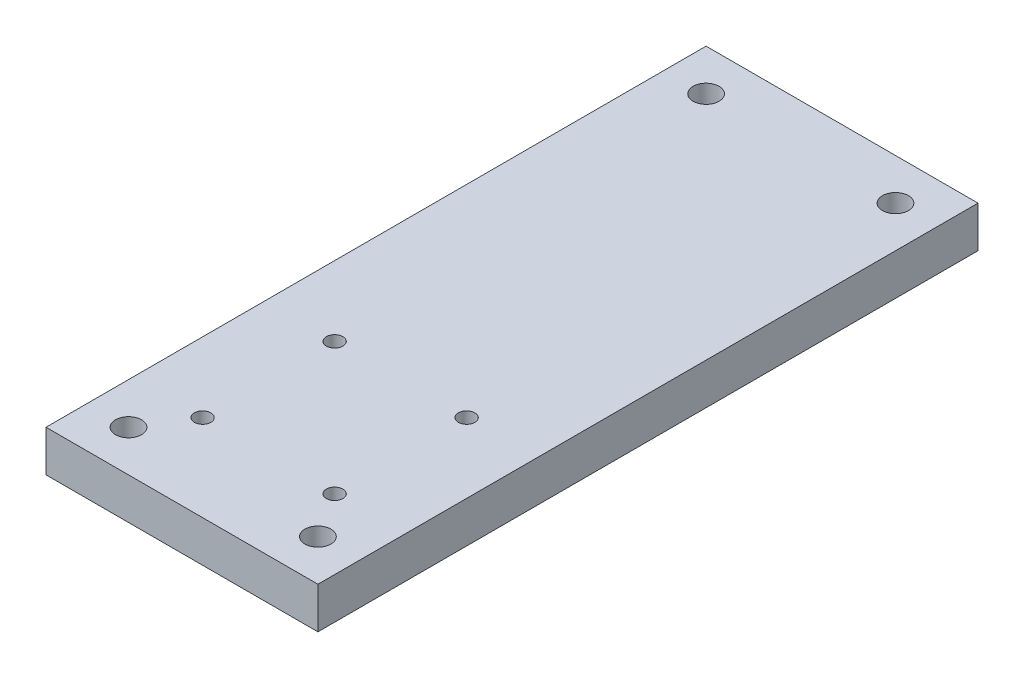
ISO-10303-21;
HEADER;
FILE_DESCRIPTION(('STEP AP214'),'2;1');
FILE_NAME('part.step','',(''),(''),'','','');
FILE_SCHEMA(('AUTOMOTIVE_DESIGN { 1 0 10303 214 1 1 1 1 }'));
ENDSEC;
DATA;
#1=APPLICATION_CONTEXT('core data for automotive mechanical design processes');
#2=APPLICATION_PROTOCOL_DEFINITION('international standard','automotive_design',2000,#1);
#3=PRODUCT_CONTEXT('',#1,'mechanical');
#4=PRODUCT('Part','Part','',(#3));
#5=PRODUCT_RELATED_PRODUCT_CATEGORY('part','',(#4));
#6=PRODUCT_DEFINITION_FORMATION('','',#4);
#7=PRODUCT_DEFINITION_CONTEXT('part definition',#1,'design');
#8=PRODUCT_DEFINITION('design','',#6,#7);
#9=PRODUCT_DEFINITION_SHAPE('','',#8);
#10=(LENGTH_UNIT() NAMED_UNIT(*) SI_UNIT(.MILLI.,.METRE.));
#11=(NAMED_UNIT(*) PLANE_ANGLE_UNIT() SI_UNIT($,.RADIAN.));
#12=(NAMED_UNIT(*) SI_UNIT($,.STERADIAN.) SOLID_ANGLE_UNIT());
#13=UNCERTAINTY_MEASURE_WITH_UNIT(LENGTH_MEASURE(1.E-05),#10,'distance_accuracy_value','');
#14=(GEOMETRIC_REPRESENTATION_CONTEXT(3) GLOBAL_UNCERTAINTY_ASSIGNED_CONTEXT((#13)) GLOBAL_UNIT_ASSIGNED_CONTEXT((#10,
#11,#12)) REPRESENTATION_CONTEXT('',''));
#15=CARTESIAN_POINT('',(0.,0.,0.));
#16=DIRECTION('',(0.,0.,1.));
#17=DIRECTION('',(1.,0.,0.));
#18=AXIS2_PLACEMENT_3D('',#15,#16,#17);
#19=CARTESIAN_POINT('',(20.,5.,0.));
#20=DIRECTION('',(-1.,0.,0.));
#21=DIRECTION('',(0.,0.,1.));
#22=AXIS2_PLACEMENT_3D('',#19,#20,#21);
#23=PLANE('',#22);
#24=DIRECTION('',(0.,0.,-1.));
#25=VECTOR('',#24,1.);
#26=CARTESIAN_POINT('',(20.,5.,0.));
#27=LINE('',#26,#25);
#28=CARTESIAN_POINT('',(20.,5.,-2.9986));
#29=VERTEX_POINT('',#28);
#30=CARTESIAN_POINT('',(20.,5.,-82.99632));
#31=VERTEX_POINT('',#30);
#32=EDGE_CURVE('E11',#29,#31,#27,.T.);
#33=ORIENTED_EDGE('',*,*,#32,.F.);
#34=DIRECTION('',(0.,-1.,0.));
#35=VECTOR('',#34,1.);
#36=CARTESIAN_POINT('',(20.,5.,-2.9986));
#37=LINE('',#36,#35);
#38=CARTESIAN_POINT('',(20.,0.,-2.9986));
#39=VERTEX_POINT('',#38);
#40=EDGE_CURVE('E103',#29,#39,#37,.T.);
#41=ORIENTED_EDGE('',*,*,#40,.T.);
#42=DIRECTION('',(0.,0.,-1.));
#43=VECTOR('',#42,1.);
#44=CARTESIAN_POINT('',(20.,0.,0.));
#45=LINE('',#44,#43);
#46=CARTESIAN_POINT('',(20.,0.,-82.99632));
#47=VERTEX_POINT('',#46);
#48=EDGE_CURVE('E50',#39,#47,#45,.T.);
#49=ORIENTED_EDGE('',*,*,#48,.T.);
#50=DIRECTION('',(0.,-1.,0.));
#51=VECTOR('',#50,1.);
#52=CARTESIAN_POINT('',(20.,5.,-82.99632));
#53=LINE('',#52,#51);
#54=EDGE_CURVE('E158',#31,#47,#53,.T.);
#55=ORIENTED_EDGE('',*,*,#54,.F.);
#56=EDGE_LOOP('',(#33,#41,#49,#55));
#57=FACE_BOUND('',#56,.T.);
#58=ADVANCED_FACE('F47',(#57),#23,.F.);
#59=CARTESIAN_POINT('',(0.,5.,0.));
#60=DIRECTION('',(0.,-1.,0.));
#61=DIRECTION('',(0.,0.,-1.));
#62=AXIS2_PLACEMENT_3D('',#59,#60,#61);
#63=PLANE('',#62);
#64=CARTESIAN_POINT('',(-7.954,5.,-77.99632));
#65=DIRECTION('',(0.,-1.,0.));
#66=DIRECTION('',(0.,0.,-1.));
#67=AXIS2_PLACEMENT_3D('',#64,#65,#66);
#68=CIRCLE('',#67,1.575);
#69=CARTESIAN_POINT('',(-7.954,5.,-79.57132));
#70=VERTEX_POINT('',#69);
#71=EDGE_CURVE('E178',#70,#70,#68,.T.);
#72=ORIENTED_EDGE('',*,*,#71,.T.);
#73=EDGE_LOOP('',(#72));
#74=FACE_BOUND('',#73,.T.);
#75=CARTESIAN_POINT('',(15.,5.,-77.99632));
#76=DIRECTION('',(0.,-1.,0.));
#77=DIRECTION('',(0.,0.,-1.));
#78=AXIS2_PLACEMENT_3D('',#75,#76,#77);
#79=CIRCLE('',#78,1.575);
#80=CARTESIAN_POINT('',(15.,5.,-79.57132));
#81=VERTEX_POINT('',#80);
#82=EDGE_CURVE('E186',#81,#81,#79,.T.);
#83=ORIENTED_EDGE('',*,*,#82,.T.);
#84=EDGE_LOOP('',(#83));
#85=FACE_BOUND('',#84,.T.);
#86=CARTESIAN_POINT('',(15.,5.,-7.9986));
#87=DIRECTION('',(0.,-1.,0.));
#88=DIRECTION('',(0.,0.,-1.));
#89=AXIS2_PLACEMENT_3D('',#86,#87,#88);
#90=CIRCLE('',#89,1.575);
#91=CARTESIAN_POINT('',(15.,5.,-9.5736));
#92=VERTEX_POINT('',#91);
#93=EDGE_CURVE('E194',#92,#92,#90,.T.);
#94=ORIENTED_EDGE('',*,*,#93,.T.);
#95=EDGE_LOOP('',(#94));
#96=FACE_BOUND('',#95,.T.);
#97=CARTESIAN_POINT('',(-7.954,5.,-7.99859999999999));
#98=DIRECTION('',(0.,-1.,0.));
#99=DIRECTION('',(0.,0.,-1.));
#100=AXIS2_PLACEMENT_3D('',#97,#98,#99);
#101=CIRCLE('',#100,1.575);
#102=CARTESIAN_POINT('',(-7.954,5.,-9.5736));
#103=VERTEX_POINT('',#102);
#104=EDGE_CURVE('E163',#103,#103,#101,.T.);
#105=ORIENTED_EDGE('',*,*,#104,.T.);
#106=EDGE_LOOP('',(#105));
#107=FACE_BOUND('',#106,.T.);
#108=CARTESIAN_POINT('',(-4.477,5.,-29.5));
#109=DIRECTION('',(0.,-1.,0.));
#110=DIRECTION('',(0.,0.,-1.));
#111=AXIS2_PLACEMENT_3D('',#108,#109,#110);
#112=CIRCLE('',#111,1.);
#113=CARTESIAN_POINT('',(-4.477,5.,-30.5));
#114=VERTEX_POINT('',#113);
#115=EDGE_CURVE('E131',#114,#114,#112,.T.);
#116=ORIENTED_EDGE('',*,*,#115,.T.);
#117=EDGE_LOOP('',(#116));
#118=FACE_BOUND('',#117,.T.);
#119=CARTESIAN_POINT('',(11.523,5.,-29.5));
#120=DIRECTION('',(0.,-1.,0.));
#121=DIRECTION('',(0.,0.,-1.));
#122=AXIS2_PLACEMENT_3D('',#119,#120,#121);
#123=CIRCLE('',#122,1.);
#124=CARTESIAN_POINT('',(11.523,5.,-30.5));
#125=VERTEX_POINT('',#124);
#126=EDGE_CURVE('E139',#125,#125,#123,.T.);
#127=ORIENTED_EDGE('',*,*,#126,.T.);
#128=EDGE_LOOP('',(#127));
#129=FACE_BOUND('',#128,.T.);
#130=CARTESIAN_POINT('',(11.523,5.,-13.5));
#131=DIRECTION('',(0.,-1.,0.));
#132=DIRECTION('',(0.,0.,-1.));
#133=AXIS2_PLACEMENT_3D('',#130,#131,#132);
#134=CIRCLE('',#133,1.);
#135=CARTESIAN_POINT('',(11.523,5.,-14.5));
#136=VERTEX_POINT('',#135);
#137=EDGE_CURVE('E147',#136,#136,#134,.T.);
#138=ORIENTED_EDGE('',*,*,#137,.T.);
#139=EDGE_LOOP('',(#138));
#140=FACE_BOUND('',#139,.T.);
#141=CARTESIAN_POINT('',(-4.477,5.,-13.5));
#142=DIRECTION('',(0.,-1.,0.));
#143=DIRECTION('',(0.,0.,-1.));
#144=AXIS2_PLACEMENT_3D('',#141,#142,#143);
#145=CIRCLE('',#144,1.);
#146=CARTESIAN_POINT('',(-4.477,5.,-14.5));
#147=VERTEX_POINT('',#146);
#148=EDGE_CURVE('E118',#147,#147,#145,.T.);
#149=ORIENTED_EDGE('',*,*,#148,.T.);
#150=EDGE_LOOP('',(#149));
#151=FACE_BOUND('',#150,.T.);
#152=DIRECTION('',(0.,0.,-1.));
#153=VECTOR('',#152,1.);
#154=CARTESIAN_POINT('',(-12.954,5.,-1.5));
#155=LINE('',#154,#153);
#156=CARTESIAN_POINT('',(-12.954,5.,-2.9986));
#157=VERTEX_POINT('',#156);
#158=CARTESIAN_POINT('',(-12.954,5.,-82.99632));
#159=VERTEX_POINT('',#158);
#160=EDGE_CURVE('E117',#157,#159,#155,.T.);
#161=ORIENTED_EDGE('',*,*,#160,.F.);
#162=DIRECTION('',(1.,0.,0.));
#163=VECTOR('',#162,1.);
#164=CARTESIAN_POINT('',(-12.954,5.,-2.9986));
#165=LINE('',#164,#163);
#166=EDGE_CURVE('E64',#157,#29,#165,.T.);
#167=ORIENTED_EDGE('',*,*,#166,.T.);
#168=ORIENTED_EDGE('',*,*,#32,.T.);
#169=DIRECTION('',(-1.,0.,0.));
#170=VECTOR('',#169,1.);
#171=CARTESIAN_POINT('',(-12.954,5.,-82.99632));
#172=LINE('',#171,#170);
#173=EDGE_CURVE('E154',#31,#159,#172,.T.);
#174=ORIENTED_EDGE('',*,*,#173,.T.);
#175=EDGE_LOOP('',(#161,#167,#168,#174));
#176=FACE_BOUND('',#175,.T.);
#177=ADVANCED_FACE('F206',(#74,#85,#96,#107,#118,#129,#140,#151,#176),#63,.F.);
#178=CARTESIAN_POINT('',(0.,0.,0.));
#179=DIRECTION('',(0.,-1.,0.));
#180=DIRECTION('',(0.,0.,-1.));
#181=AXIS2_PLACEMENT_3D('',#178,#179,#180);
#182=PLANE('',#181);
#183=CARTESIAN_POINT('',(-7.954,0.,-77.99632));
#184=DIRECTION('',(0.,-1.,0.));
#185=DIRECTION('',(0.,0.,-1.));
#186=AXIS2_PLACEMENT_3D('',#183,#184,#185);
#187=CIRCLE('',#186,1.575);
#188=CARTESIAN_POINT('',(-7.954,0.,-79.57132));
#189=VERTEX_POINT('',#188);
#190=EDGE_CURVE('E182',#189,#189,#187,.T.);
#191=ORIENTED_EDGE('',*,*,#190,.F.);
#192=EDGE_LOOP('',(#191));
#193=FACE_BOUND('',#192,.T.);
#194=CARTESIAN_POINT('',(15.,0.,-77.99632));
#195=DIRECTION('',(0.,-1.,0.));
#196=DIRECTION('',(0.,0.,-1.));
#197=AXIS2_PLACEMENT_3D('',#194,#195,#196);
#198=CIRCLE('',#197,1.575);
#199=CARTESIAN_POINT('',(15.,0.,-79.57132));
#200=VERTEX_POINT('',#199);
#201=EDGE_CURVE('E190',#200,#200,#198,.T.);
#202=ORIENTED_EDGE('',*,*,#201,.F.);
#203=EDGE_LOOP('',(#202));
#204=FACE_BOUND('',#203,.T.);
#205=CARTESIAN_POINT('',(15.,0.,-7.9986));
#206=DIRECTION('',(0.,-1.,0.));
#207=DIRECTION('',(0.,0.,-1.));
#208=AXIS2_PLACEMENT_3D('',#205,#206,#207);
#209=CIRCLE('',#208,1.575);
#210=CARTESIAN_POINT('',(15.,0.,-9.5736));
#211=VERTEX_POINT('',#210);
#212=EDGE_CURVE('E174',#211,#211,#209,.T.);
#213=ORIENTED_EDGE('',*,*,#212,.F.);
#214=EDGE_LOOP('',(#213));
#215=FACE_BOUND('',#214,.T.);
#216=CARTESIAN_POINT('',(-7.954,0.,-7.99859999999999));
#217=DIRECTION('',(0.,-1.,0.));
#218=DIRECTION('',(0.,0.,-1.));
#219=AXIS2_PLACEMENT_3D('',#216,#217,#218);
#220=CIRCLE('',#219,1.575);
#221=CARTESIAN_POINT('',(-7.954,0.,-9.5736));
#222=VERTEX_POINT('',#221);
#223=EDGE_CURVE('E170',#222,#222,#220,.T.);
#224=ORIENTED_EDGE('',*,*,#223,.F.);
#225=EDGE_LOOP('',(#224));
#226=FACE_BOUND('',#225,.T.);
#227=DIRECTION('',(1.,0.,0.));
#228=VECTOR('',#227,1.);
#229=CARTESIAN_POINT('',(-12.954,0.,-2.9986));
#230=LINE('',#229,#228);
#231=CARTESIAN_POINT('',(-12.954,0.,-2.9986));
#232=VERTEX_POINT('',#231);
#233=EDGE_CURVE('E96',#232,#39,#230,.T.);
#234=ORIENTED_EDGE('',*,*,#233,.F.);
#235=DIRECTION('',(0.,0.,1.));
#236=VECTOR('',#235,1.);
#237=CARTESIAN_POINT('',(-12.954,0.,-84.5));
#238=LINE('',#237,#236);
#239=CARTESIAN_POINT('',(-12.954,0.,-82.99632));
#240=VERTEX_POINT('',#239);
#241=EDGE_CURVE('E110',#240,#232,#238,.T.);
#242=ORIENTED_EDGE('',*,*,#241,.F.);
#243=DIRECTION('',(-1.,0.,0.));
#244=VECTOR('',#243,1.);
#245=CARTESIAN_POINT('',(-12.954,0.,-82.99632));
#246=LINE('',#245,#244);
#247=EDGE_CURVE('E75',#47,#240,#246,.T.);
#248=ORIENTED_EDGE('',*,*,#247,.F.);
#249=ORIENTED_EDGE('',*,*,#48,.F.);
#250=EDGE_LOOP('',(#234,#242,#248,#249));
#251=FACE_BOUND('',#250,.T.);
#252=CARTESIAN_POINT('',(-4.477,0.,-29.5));
#253=DIRECTION('',(0.,-1.,0.));
#254=DIRECTION('',(0.,0.,-1.));
#255=AXIS2_PLACEMENT_3D('',#252,#253,#254);
#256=CIRCLE('',#255,1.);
#257=CARTESIAN_POINT('',(-4.477,0.,-30.5));
#258=VERTEX_POINT('',#257);
#259=EDGE_CURVE('E135',#258,#258,#256,.T.);
#260=ORIENTED_EDGE('',*,*,#259,.F.);
#261=EDGE_LOOP('',(#260));
#262=FACE_BOUND('',#261,.T.);
#263=CARTESIAN_POINT('',(11.523,0.,-29.5));
#264=DIRECTION('',(0.,-1.,0.));
#265=DIRECTION('',(0.,0.,-1.));
#266=AXIS2_PLACEMENT_3D('',#263,#264,#265);
#267=CIRCLE('',#266,1.);
#268=CARTESIAN_POINT('',(11.523,0.,-30.5));
#269=VERTEX_POINT('',#268);
#270=EDGE_CURVE('E143',#269,#269,#267,.T.);
#271=ORIENTED_EDGE('',*,*,#270,.F.);
#272=EDGE_LOOP('',(#271));
#273=FACE_BOUND('',#272,.T.);
#274=CARTESIAN_POINT('',(11.523,0.,-13.5));
#275=DIRECTION('',(0.,-1.,0.));
#276=DIRECTION('',(0.,0.,-1.));
#277=AXIS2_PLACEMENT_3D('',#274,#275,#276);
#278=CIRCLE('',#277,1.);
#279=CARTESIAN_POINT('',(11.523,0.,-14.5));
#280=VERTEX_POINT('',#279);
#281=EDGE_CURVE('E129',#280,#280,#278,.T.);
#282=ORIENTED_EDGE('',*,*,#281,.F.);
#283=EDGE_LOOP('',(#282));
#284=FACE_BOUND('',#283,.T.);
#285=CARTESIAN_POINT('',(-4.477,0.,-13.5));
#286=DIRECTION('',(0.,-1.,0.));
#287=DIRECTION('',(0.,0.,-1.));
#288=AXIS2_PLACEMENT_3D('',#285,#286,#287);
#289=CIRCLE('',#288,1.);
#290=CARTESIAN_POINT('',(-4.477,0.,-14.5));
#291=VERTEX_POINT('',#290);
#292=EDGE_CURVE('E124',#291,#291,#289,.T.);
#293=ORIENTED_EDGE('',*,*,#292,.F.);
#294=EDGE_LOOP('',(#293));
#295=FACE_BOUND('',#294,.T.);
#296=ADVANCED_FACE('F108',(#193,#204,#215,#226,#251,#262,#273,#284,#295),#182,.T.);
#297=CARTESIAN_POINT('',(-12.954,0.,0.));
#298=DIRECTION('',(-1.,0.,0.));
#299=DIRECTION('',(0.,0.,1.));
#300=AXIS2_PLACEMENT_3D('',#297,#298,#299);
#301=PLANE('',#300);
#302=DIRECTION('',(0.,-1.,0.));
#303=VECTOR('',#302,1.);
#304=CARTESIAN_POINT('',(-12.954,5.,-2.9986));
#305=LINE('',#304,#303);
#306=EDGE_CURVE('E93',#157,#232,#305,.T.);
#307=ORIENTED_EDGE('',*,*,#306,.F.);
#308=ORIENTED_EDGE('',*,*,#160,.T.);
#309=DIRECTION('',(0.,-1.,0.));
#310=VECTOR('',#309,1.);
#311=CARTESIAN_POINT('',(-12.954,5.,-82.99632));
#312=LINE('',#311,#310);
#313=EDGE_CURVE('E115',#159,#240,#312,.T.);
#314=ORIENTED_EDGE('',*,*,#313,.T.);
#315=ORIENTED_EDGE('',*,*,#241,.T.);
#316=EDGE_LOOP('',(#307,#308,#314,#315));
#317=FACE_BOUND('',#316,.T.);
#318=ADVANCED_FACE('F114',(#317),#301,.T.);
#319=CARTESIAN_POINT('',(-4.477,5.,-13.5));
#320=DIRECTION('',(0.,-1.,0.));
#321=DIRECTION('',(0.,0.,-1.));
#322=AXIS2_PLACEMENT_3D('',#319,#320,#321);
#323=CYLINDRICAL_SURFACE('',#322,1.);
#324=ORIENTED_EDGE('',*,*,#148,.F.);
#325=EDGE_LOOP('',(#324));
#326=FACE_BOUND('',#325,.T.);
#327=ORIENTED_EDGE('',*,*,#292,.T.);
#328=EDGE_LOOP('',(#327));
#329=FACE_BOUND('',#328,.T.);
#330=ADVANCED_FACE('F248',(#326,#329),#323,.F.);
#331=CARTESIAN_POINT('',(11.523,5.,-13.5));
#332=DIRECTION('',(0.,-1.,0.));
#333=DIRECTION('',(0.,0.,-1.));
#334=AXIS2_PLACEMENT_3D('',#331,#332,#333);
#335=CYLINDRICAL_SURFACE('',#334,1.);
#336=ORIENTED_EDGE('',*,*,#137,.F.);
#337=EDGE_LOOP('',(#336));
#338=FACE_BOUND('',#337,.T.);
#339=ORIENTED_EDGE('',*,*,#281,.T.);
#340=EDGE_LOOP('',(#339));
#341=FACE_BOUND('',#340,.T.);
#342=ADVANCED_FACE('F245',(#338,#341),#335,.F.);
#343=CARTESIAN_POINT('',(11.523,5.,-29.5));
#344=DIRECTION('',(0.,-1.,0.));
#345=DIRECTION('',(0.,0.,-1.));
#346=AXIS2_PLACEMENT_3D('',#343,#344,#345);
#347=CYLINDRICAL_SURFACE('',#346,1.);
#348=ORIENTED_EDGE('',*,*,#126,.F.);
#349=EDGE_LOOP('',(#348));
#350=FACE_BOUND('',#349,.T.);
#351=ORIENTED_EDGE('',*,*,#270,.T.);
#352=EDGE_LOOP('',(#351));
#353=FACE_BOUND('',#352,.T.);
#354=ADVANCED_FACE('F241',(#350,#353),#347,.F.);
#355=CARTESIAN_POINT('',(-4.477,5.,-29.5));
#356=DIRECTION('',(0.,-1.,0.));
#357=DIRECTION('',(0.,0.,-1.));
#358=AXIS2_PLACEMENT_3D('',#355,#356,#357);
#359=CYLINDRICAL_SURFACE('',#358,1.);
#360=ORIENTED_EDGE('',*,*,#115,.F.);
#361=EDGE_LOOP('',(#360));
#362=FACE_BOUND('',#361,.T.);
#363=ORIENTED_EDGE('',*,*,#259,.T.);
#364=EDGE_LOOP('',(#363));
#365=FACE_BOUND('',#364,.T.);
#366=ADVANCED_FACE('F236',(#362,#365),#359,.F.);
#367=CARTESIAN_POINT('',(-12.954,5.,-82.99632));
#368=DIRECTION('',(0.,0.,1.));
#369=DIRECTION('',(1.,0.,0.));
#370=AXIS2_PLACEMENT_3D('',#367,#368,#369);
#371=PLANE('',#370);
#372=ORIENTED_EDGE('',*,*,#247,.T.);
#373=ORIENTED_EDGE('',*,*,#313,.F.);
#374=ORIENTED_EDGE('',*,*,#173,.F.);
#375=ORIENTED_EDGE('',*,*,#54,.T.);
#376=EDGE_LOOP('',(#372,#373,#374,#375));
#377=FACE_BOUND('',#376,.T.);
#378=ADVANCED_FACE('F221',(#377),#371,.F.);
#379=CARTESIAN_POINT('',(-12.954,5.,-2.9986));
#380=DIRECTION('',(0.,0.,-1.));
#381=DIRECTION('',(-1.,0.,0.));
#382=AXIS2_PLACEMENT_3D('',#379,#380,#381);
#383=PLANE('',#382);
#384=ORIENTED_EDGE('',*,*,#233,.T.);
#385=ORIENTED_EDGE('',*,*,#40,.F.);
#386=ORIENTED_EDGE('',*,*,#166,.F.);
#387=ORIENTED_EDGE('',*,*,#306,.T.);
#388=EDGE_LOOP('',(#384,#385,#386,#387));
#389=FACE_BOUND('',#388,.T.);
#390=ADVANCED_FACE('F95',(#389),#383,.F.);
#391=CARTESIAN_POINT('',(-7.954,5.,-7.99859999999999));
#392=DIRECTION('',(0.,-1.,0.));
#393=DIRECTION('',(0.,0.,-1.));
#394=AXIS2_PLACEMENT_3D('',#391,#392,#393);
#395=CYLINDRICAL_SURFACE('',#394,1.575);
#396=ORIENTED_EDGE('',*,*,#104,.F.);
#397=EDGE_LOOP('',(#396));
#398=FACE_BOUND('',#397,.T.);
#399=ORIENTED_EDGE('',*,*,#223,.T.);
#400=EDGE_LOOP('',(#399));
#401=FACE_BOUND('',#400,.T.);
#402=ADVANCED_FACE('F210',(#398,#401),#395,.F.);
#403=CARTESIAN_POINT('',(15.,5.,-7.9986));
#404=DIRECTION('',(0.,-1.,0.));
#405=DIRECTION('',(0.,0.,-1.));
#406=AXIS2_PLACEMENT_3D('',#403,#404,#405);
#407=CYLINDRICAL_SURFACE('',#406,1.575);
#408=ORIENTED_EDGE('',*,*,#93,.F.);
#409=EDGE_LOOP('',(#408));
#410=FACE_BOUND('',#409,.T.);
#411=ORIENTED_EDGE('',*,*,#212,.T.);
#412=EDGE_LOOP('',(#411));
#413=FACE_BOUND('',#412,.T.);
#414=ADVANCED_FACE('F202',(#410,#413),#407,.F.);
#415=CARTESIAN_POINT('',(15.,5.,-77.99632));
#416=DIRECTION('',(0.,-1.,0.));
#417=DIRECTION('',(0.,0.,-1.));
#418=AXIS2_PLACEMENT_3D('',#415,#416,#417);
#419=CYLINDRICAL_SURFACE('',#418,1.575);
#420=ORIENTED_EDGE('',*,*,#82,.F.);
#421=EDGE_LOOP('',(#420));
#422=FACE_BOUND('',#421,.T.);
#423=ORIENTED_EDGE('',*,*,#201,.T.);
#424=EDGE_LOOP('',(#423));
#425=FACE_BOUND('',#424,.T.);
#426=ADVANCED_FACE('F217',(#422,#425),#419,.F.);
#427=CARTESIAN_POINT('',(-7.954,5.,-77.99632));
#428=DIRECTION('',(0.,-1.,0.));
#429=DIRECTION('',(0.,0.,-1.));
#430=AXIS2_PLACEMENT_3D('',#427,#428,#429);
#431=CYLINDRICAL_SURFACE('',#430,1.575);
#432=ORIENTED_EDGE('',*,*,#71,.F.);
#433=EDGE_LOOP('',(#432));
#434=FACE_BOUND('',#433,.T.);
#435=ORIENTED_EDGE('',*,*,#190,.T.);
#436=EDGE_LOOP('',(#435));
#437=FACE_BOUND('',#436,.T.);
#438=ADVANCED_FACE('F259',(#434,#437),#431,.F.);
#439=CLOSED_SHELL('',(#58,#177,#296,#318,#330,#342,#354,#366,#378,#390,#402,#414,#426,#438));
#440=MANIFOLD_SOLID_BREP('B2',#439);
#441=ADVANCED_BREP_SHAPE_REPRESENTATION('',(#18,#440),#14);
#442=SHAPE_DEFINITION_REPRESENTATION(#9,#441);
ENDSEC;
END-ISO-10303-21;
